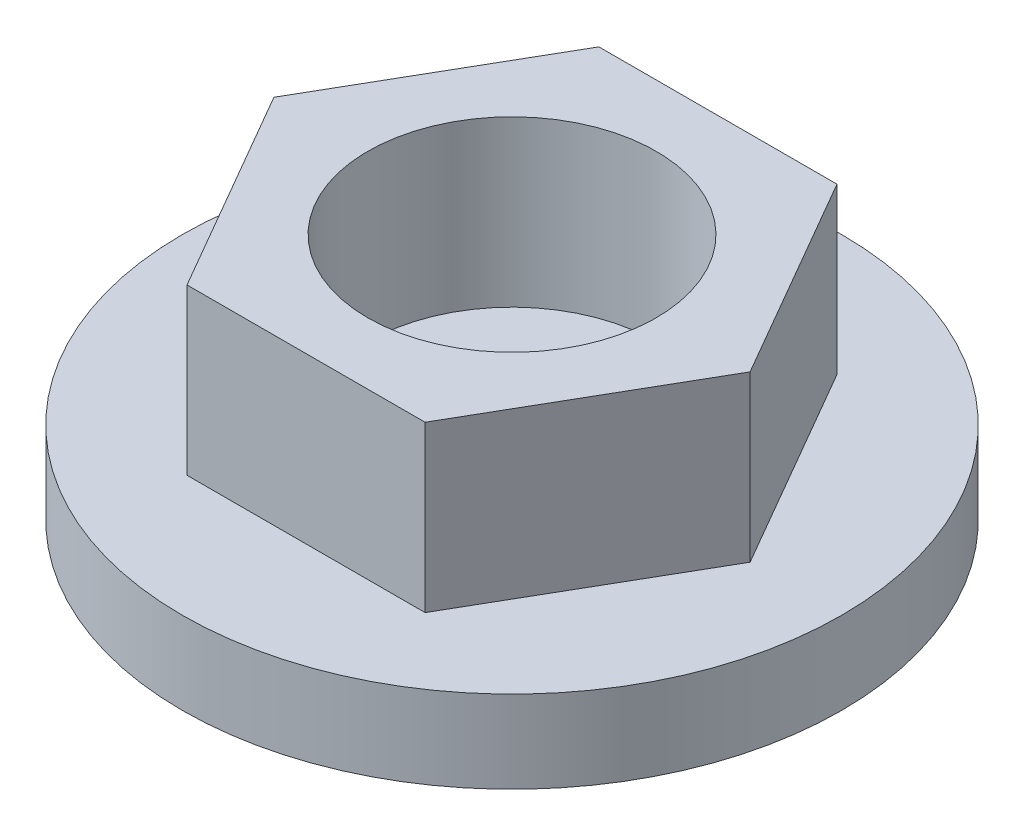
ISO-10303-21;
HEADER;
FILE_DESCRIPTION(('STEP AP214'),'2;1');
FILE_NAME('part.step','',(''),(''),'','','');
FILE_SCHEMA(('AUTOMOTIVE_DESIGN { 1 0 10303 214 1 1 1 1 }'));
ENDSEC;
DATA;
#1=APPLICATION_CONTEXT('core data for automotive mechanical design processes');
#2=APPLICATION_PROTOCOL_DEFINITION('international standard','automotive_design',2000,#1);
#3=PRODUCT_CONTEXT('',#1,'mechanical');
#4=PRODUCT('Part','Part','',(#3));
#5=PRODUCT_RELATED_PRODUCT_CATEGORY('part','',(#4));
#6=PRODUCT_DEFINITION_FORMATION('','',#4);
#7=PRODUCT_DEFINITION_CONTEXT('part definition',#1,'design');
#8=PRODUCT_DEFINITION('design','',#6,#7);
#9=PRODUCT_DEFINITION_SHAPE('','',#8);
#10=(LENGTH_UNIT() NAMED_UNIT(*) SI_UNIT(.MILLI.,.METRE.));
#11=(NAMED_UNIT(*) PLANE_ANGLE_UNIT() SI_UNIT($,.RADIAN.));
#12=(NAMED_UNIT(*) SI_UNIT($,.STERADIAN.) SOLID_ANGLE_UNIT());
#13=UNCERTAINTY_MEASURE_WITH_UNIT(LENGTH_MEASURE(1.E-05),#10,'distance_accuracy_value','');
#14=(GEOMETRIC_REPRESENTATION_CONTEXT(3) GLOBAL_UNCERTAINTY_ASSIGNED_CONTEXT((#13)) GLOBAL_UNIT_ASSIGNED_CONTEXT((#10,
#11,#12)) REPRESENTATION_CONTEXT('',''));
#15=CARTESIAN_POINT('',(0.,0.,0.));
#16=DIRECTION('',(0.,0.,1.));
#17=DIRECTION('',(1.,0.,0.));
#18=AXIS2_PLACEMENT_3D('',#15,#16,#17);
#19=CARTESIAN_POINT('',(0.,1.,0.));
#20=DIRECTION('',(0.,-1.,0.));
#21=DIRECTION('',(0.,0.,-1.));
#22=AXIS2_PLACEMENT_3D('',#19,#20,#21);
#23=CYLINDRICAL_SURFACE('',#22,4.);
#24=CARTESIAN_POINT('',(0.,1.,0.));
#25=DIRECTION('',(0.,1.,0.));
#26=DIRECTION('',(0.,0.,1.));
#27=AXIS2_PLACEMENT_3D('',#24,#25,#26);
#28=CIRCLE('',#27,4.);
#29=CARTESIAN_POINT('',(0.,1.,4.));
#30=VERTEX_POINT('',#29);
#31=EDGE_CURVE('E41',#30,#30,#28,.T.);
#32=ORIENTED_EDGE('',*,*,#31,.F.);
#33=EDGE_LOOP('',(#32));
#34=FACE_BOUND('',#33,.T.);
#35=CARTESIAN_POINT('',(0.,0.,0.));
#36=DIRECTION('',(0.,1.,0.));
#37=DIRECTION('',(0.,0.,1.));
#38=AXIS2_PLACEMENT_3D('',#35,#36,#37);
#39=CIRCLE('',#38,4.);
#40=CARTESIAN_POINT('',(0.,0.,4.));
#41=VERTEX_POINT('',#40);
#42=EDGE_CURVE('E139',#41,#41,#39,.T.);
#43=ORIENTED_EDGE('',*,*,#42,.T.);
#44=EDGE_LOOP('',(#43));
#45=FACE_BOUND('',#44,.T.);
#46=ADVANCED_FACE('F34',(#34,#45),#23,.T.);
#47=CARTESIAN_POINT('',(0.,1.,0.));
#48=DIRECTION('',(0.,1.,0.));
#49=DIRECTION('',(0.,0.,1.));
#50=AXIS2_PLACEMENT_3D('',#47,#48,#49);
#51=PLANE('',#50);
#52=DIRECTION('',(-0.999999831530858,0.,0.000580463828294125));
#53=VECTOR('',#52,1.);
#54=CARTESIAN_POINT('',(1.44192427023907,1.,-2.50083740619595));
#55=LINE('',#54,#53);
#56=CARTESIAN_POINT('',(1.44192427023907,1.,-2.50083740619595));
#57=VERTEX_POINT('',#56);
#58=CARTESIAN_POINT('',(-1.44482658938054,1.,-2.49916175145834));
#59=VERTEX_POINT('',#58);
#60=EDGE_CURVE('E121',#57,#59,#55,.T.);
#61=ORIENTED_EDGE('',*,*,#60,.F.);
#62=DIRECTION('',(-0.50050261218671,0.,-0.865735025971735));
#63=VECTOR('',#62,1.);
#64=CARTESIAN_POINT('',(2.8867508596196,1.,-0.00167565473760398));
#65=LINE('',#64,#63);
#66=CARTESIAN_POINT('',(2.8867508596196,1.,-0.00167565473760398));
#67=VERTEX_POINT('',#66);
#68=EDGE_CURVE('E118',#67,#57,#65,.T.);
#69=ORIENTED_EDGE('',*,*,#68,.F.);
#70=DIRECTION('',(0.499497219344148,0.,-0.866315489800029));
#71=VECTOR('',#70,1.);
#72=CARTESIAN_POINT('',(1.44482658938054,1.,2.49916175145834));
#73=LINE('',#72,#71);
#74=CARTESIAN_POINT('',(1.44482658938054,1.,2.49916175145834));
#75=VERTEX_POINT('',#74);
#76=EDGE_CURVE('E76',#75,#67,#73,.T.);
#77=ORIENTED_EDGE('',*,*,#76,.F.);
#78=DIRECTION('',(0.999999831530858,0.,-0.000580463828294125));
#79=VECTOR('',#78,1.);
#80=CARTESIAN_POINT('',(-1.44192427023907,1.,2.50083740619595));
#81=LINE('',#80,#79);
#82=CARTESIAN_POINT('',(-1.44192427023907,1.,2.50083740619595));
#83=VERTEX_POINT('',#82);
#84=EDGE_CURVE('E127',#83,#75,#81,.T.);
#85=ORIENTED_EDGE('',*,*,#84,.F.);
#86=DIRECTION('',(0.50050261218671,0.,0.865735025971734));
#87=VECTOR('',#86,1.);
#88=CARTESIAN_POINT('',(-2.8867508596196,1.,0.00167565473760394));
#89=LINE('',#88,#87);
#90=CARTESIAN_POINT('',(-2.8867508596196,1.,0.00167565473760394));
#91=VERTEX_POINT('',#90);
#92=EDGE_CURVE('E107',#91,#83,#89,.T.);
#93=ORIENTED_EDGE('',*,*,#92,.F.);
#94=DIRECTION('',(-0.499497219344148,0.,0.866315489800029));
#95=VECTOR('',#94,1.);
#96=CARTESIAN_POINT('',(-1.44482658938054,1.,-2.49916175145834));
#97=LINE('',#96,#95);
#98=EDGE_CURVE('E124',#59,#91,#97,.T.);
#99=ORIENTED_EDGE('',*,*,#98,.F.);
#100=EDGE_LOOP('',(#61,#69,#77,#85,#93,#99));
#101=FACE_BOUND('',#100,.T.);
#102=ORIENTED_EDGE('',*,*,#31,.T.);
#103=EDGE_LOOP('',(#102));
#104=FACE_BOUND('',#103,.T.);
#105=ADVANCED_FACE('F147',(#101,#104),#51,.T.);
#106=CARTESIAN_POINT('',(0.,0.,0.));
#107=DIRECTION('',(0.,1.,0.));
#108=DIRECTION('',(0.,0.,1.));
#109=AXIS2_PLACEMENT_3D('',#106,#107,#108);
#110=PLANE('',#109);
#111=ORIENTED_EDGE('',*,*,#42,.F.);
#112=EDGE_LOOP('',(#111));
#113=FACE_BOUND('',#112,.T.);
#114=ADVANCED_FACE('F145',(#113),#110,.F.);
#115=CARTESIAN_POINT('',(0.,3.,0.));
#116=DIRECTION('',(0.,1.,0.));
#117=DIRECTION('',(0.,0.,1.));
#118=AXIS2_PLACEMENT_3D('',#115,#116,#117);
#119=PLANE('',#118);
#120=DIRECTION('',(-0.50050261218671,0.,-0.865735025971735));
#121=VECTOR('',#120,1.);
#122=CARTESIAN_POINT('',(2.8867508596196,3.,-0.00167565473760398));
#123=LINE('',#122,#121);
#124=CARTESIAN_POINT('',(2.8867508596196,3.,-0.00167565473760398));
#125=VERTEX_POINT('',#124);
#126=CARTESIAN_POINT('',(1.44192427023907,3.,-2.50083740619595));
#127=VERTEX_POINT('',#126);
#128=EDGE_CURVE('E130',#125,#127,#123,.T.);
#129=ORIENTED_EDGE('',*,*,#128,.T.);
#130=DIRECTION('',(-0.999999831530858,0.,0.000580463828294125));
#131=VECTOR('',#130,1.);
#132=CARTESIAN_POINT('',(1.44192427023907,3.,-2.50083740619595));
#133=LINE('',#132,#131);
#134=CARTESIAN_POINT('',(-1.44482658938054,3.,-2.49916175145834));
#135=VERTEX_POINT('',#134);
#136=EDGE_CURVE('E84',#127,#135,#133,.T.);
#137=ORIENTED_EDGE('',*,*,#136,.T.);
#138=DIRECTION('',(-0.499497219344148,0.,0.866315489800029));
#139=VECTOR('',#138,1.);
#140=CARTESIAN_POINT('',(-1.44482658938054,3.,-2.49916175145834));
#141=LINE('',#140,#139);
#142=CARTESIAN_POINT('',(-2.8867508596196,3.,0.00167565473760394));
#143=VERTEX_POINT('',#142);
#144=EDGE_CURVE('E98',#135,#143,#141,.T.);
#145=ORIENTED_EDGE('',*,*,#144,.T.);
#146=DIRECTION('',(0.50050261218671,0.,0.865735025971734));
#147=VECTOR('',#146,1.);
#148=CARTESIAN_POINT('',(-2.8867508596196,3.,0.00167565473760394));
#149=LINE('',#148,#147);
#150=CARTESIAN_POINT('',(-1.44192427023907,3.,2.50083740619595));
#151=VERTEX_POINT('',#150);
#152=EDGE_CURVE('E91',#143,#151,#149,.T.);
#153=ORIENTED_EDGE('',*,*,#152,.T.);
#154=DIRECTION('',(0.999999831530858,0.,-0.000580463828294125));
#155=VECTOR('',#154,1.);
#156=CARTESIAN_POINT('',(-1.44192427023907,3.,2.50083740619595));
#157=LINE('',#156,#155);
#158=CARTESIAN_POINT('',(1.44482658938054,3.,2.49916175145834));
#159=VERTEX_POINT('',#158);
#160=EDGE_CURVE('E96',#151,#159,#157,.T.);
#161=ORIENTED_EDGE('',*,*,#160,.T.);
#162=DIRECTION('',(0.499497219344148,0.,-0.866315489800029));
#163=VECTOR('',#162,1.);
#164=CARTESIAN_POINT('',(1.44482658938054,3.,2.49916175145834));
#165=LINE('',#164,#163);
#166=EDGE_CURVE('E56',#159,#125,#165,.T.);
#167=ORIENTED_EDGE('',*,*,#166,.T.);
#168=EDGE_LOOP('',(#129,#137,#145,#153,#161,#167));
#169=FACE_BOUND('',#168,.T.);
#170=CARTESIAN_POINT('',(0.,3.,0.));
#171=DIRECTION('',(0.,1.,0.));
#172=DIRECTION('',(0.,0.,1.));
#173=AXIS2_PLACEMENT_3D('',#170,#171,#172);
#174=CIRCLE('',#173,1.75);
#175=CARTESIAN_POINT('',(0.,3.,1.75));
#176=VERTEX_POINT('',#175);
#177=EDGE_CURVE('E122',#176,#176,#174,.T.);
#178=ORIENTED_EDGE('',*,*,#177,.F.);
#179=EDGE_LOOP('',(#178));
#180=FACE_BOUND('',#179,.T.);
#181=ADVANCED_FACE('F93',(#169,#180),#119,.T.);
#182=CARTESIAN_POINT('',(2.8867508596196,3.,-0.00167565473760398));
#183=DIRECTION('',(-0.865735025971735,0.,0.50050261218671));
#184=DIRECTION('',(0.50050261218671,0.,0.865735025971735));
#185=AXIS2_PLACEMENT_3D('',#182,#183,#184);
#186=PLANE('',#185);
#187=ORIENTED_EDGE('',*,*,#68,.T.);
#188=DIRECTION('',(0.,-1.,0.));
#189=VECTOR('',#188,1.);
#190=CARTESIAN_POINT('',(1.44192427023907,3.,-2.50083740619595));
#191=LINE('',#190,#189);
#192=EDGE_CURVE('E137',#127,#57,#191,.T.);
#193=ORIENTED_EDGE('',*,*,#192,.F.);
#194=ORIENTED_EDGE('',*,*,#128,.F.);
#195=DIRECTION('',(0.,-1.,0.));
#196=VECTOR('',#195,1.);
#197=CARTESIAN_POINT('',(2.8867508596196,3.,-0.00167565473760398));
#198=LINE('',#197,#196);
#199=EDGE_CURVE('E114',#125,#67,#198,.T.);
#200=ORIENTED_EDGE('',*,*,#199,.T.);
#201=EDGE_LOOP('',(#187,#193,#194,#200));
#202=FACE_BOUND('',#201,.T.);
#203=ADVANCED_FACE('F152',(#202),#186,.F.);
#204=CARTESIAN_POINT('',(1.44192427023907,3.,-2.50083740619595));
#205=DIRECTION('',(0.000580463828294125,0.,0.999999831530858));
#206=DIRECTION('',(0.999999831530858,0.,-0.000580463828294125));
#207=AXIS2_PLACEMENT_3D('',#204,#205,#206);
#208=PLANE('',#207);
#209=ORIENTED_EDGE('',*,*,#60,.T.);
#210=DIRECTION('',(0.,-1.,0.));
#211=VECTOR('',#210,1.);
#212=CARTESIAN_POINT('',(-1.44482658938054,3.,-2.49916175145834));
#213=LINE('',#212,#211);
#214=EDGE_CURVE('E134',#135,#59,#213,.T.);
#215=ORIENTED_EDGE('',*,*,#214,.F.);
#216=ORIENTED_EDGE('',*,*,#136,.F.);
#217=ORIENTED_EDGE('',*,*,#192,.T.);
#218=EDGE_LOOP('',(#209,#215,#216,#217));
#219=FACE_BOUND('',#218,.T.);
#220=ADVANCED_FACE('F185',(#219),#208,.F.);
#221=CARTESIAN_POINT('',(-1.44482658938054,3.,-2.49916175145834));
#222=DIRECTION('',(0.866315489800029,0.,0.499497219344148));
#223=DIRECTION('',(0.499497219344148,0.,-0.866315489800029));
#224=AXIS2_PLACEMENT_3D('',#221,#222,#223);
#225=PLANE('',#224);
#226=ORIENTED_EDGE('',*,*,#98,.T.);
#227=DIRECTION('',(0.,-1.,0.));
#228=VECTOR('',#227,1.);
#229=CARTESIAN_POINT('',(-2.8867508596196,3.,0.00167565473760394));
#230=LINE('',#229,#228);
#231=EDGE_CURVE('E110',#143,#91,#230,.T.);
#232=ORIENTED_EDGE('',*,*,#231,.F.);
#233=ORIENTED_EDGE('',*,*,#144,.F.);
#234=ORIENTED_EDGE('',*,*,#214,.T.);
#235=EDGE_LOOP('',(#226,#232,#233,#234));
#236=FACE_BOUND('',#235,.T.);
#237=ADVANCED_FACE('F195',(#236),#225,.F.);
#238=CARTESIAN_POINT('',(-2.8867508596196,3.,0.00167565473760394));
#239=DIRECTION('',(0.865735025971735,0.,-0.50050261218671));
#240=DIRECTION('',(-0.50050261218671,0.,-0.865735025971735));
#241=AXIS2_PLACEMENT_3D('',#238,#239,#240);
#242=PLANE('',#241);
#243=ORIENTED_EDGE('',*,*,#92,.T.);
#244=DIRECTION('',(0.,-1.,0.));
#245=VECTOR('',#244,1.);
#246=CARTESIAN_POINT('',(-1.44192427023907,3.,2.50083740619595));
#247=LINE('',#246,#245);
#248=EDGE_CURVE('E104',#151,#83,#247,.T.);
#249=ORIENTED_EDGE('',*,*,#248,.F.);
#250=ORIENTED_EDGE('',*,*,#152,.F.);
#251=ORIENTED_EDGE('',*,*,#231,.T.);
#252=EDGE_LOOP('',(#243,#249,#250,#251));
#253=FACE_BOUND('',#252,.T.);
#254=ADVANCED_FACE('F105',(#253),#242,.F.);
#255=CARTESIAN_POINT('',(-1.44192427023907,3.,2.50083740619595));
#256=DIRECTION('',(-0.000580463828294125,0.,-0.999999831530858));
#257=DIRECTION('',(-0.999999831530858,0.,0.000580463828294125));
#258=AXIS2_PLACEMENT_3D('',#255,#256,#257);
#259=PLANE('',#258);
#260=ORIENTED_EDGE('',*,*,#84,.T.);
#261=DIRECTION('',(0.,-1.,0.));
#262=VECTOR('',#261,1.);
#263=CARTESIAN_POINT('',(1.44482658938054,3.,2.49916175145834));
#264=LINE('',#263,#262);
#265=EDGE_CURVE('E48',#159,#75,#264,.T.);
#266=ORIENTED_EDGE('',*,*,#265,.F.);
#267=ORIENTED_EDGE('',*,*,#160,.F.);
#268=ORIENTED_EDGE('',*,*,#248,.T.);
#269=EDGE_LOOP('',(#260,#266,#267,#268));
#270=FACE_BOUND('',#269,.T.);
#271=ADVANCED_FACE('F112',(#270),#259,.F.);
#272=CARTESIAN_POINT('',(1.44482658938054,3.,2.49916175145834));
#273=DIRECTION('',(-0.866315489800029,0.,-0.499497219344148));
#274=DIRECTION('',(-0.499497219344148,0.,0.866315489800029));
#275=AXIS2_PLACEMENT_3D('',#272,#273,#274);
#276=PLANE('',#275);
#277=ORIENTED_EDGE('',*,*,#76,.T.);
#278=ORIENTED_EDGE('',*,*,#199,.F.);
#279=ORIENTED_EDGE('',*,*,#166,.F.);
#280=ORIENTED_EDGE('',*,*,#265,.T.);
#281=EDGE_LOOP('',(#277,#278,#279,#280));
#282=FACE_BOUND('',#281,.T.);
#283=ADVANCED_FACE('F221',(#282),#276,.F.);
#284=CARTESIAN_POINT('',(0.,3.,0.));
#285=DIRECTION('',(0.,-1.,0.));
#286=DIRECTION('',(0.,0.,-1.));
#287=AXIS2_PLACEMENT_3D('',#284,#285,#286);
#288=CYLINDRICAL_SURFACE('',#287,1.75);
#289=ORIENTED_EDGE('',*,*,#177,.T.);
#290=EDGE_LOOP('',(#289));
#291=FACE_BOUND('',#290,.T.);
#292=CARTESIAN_POINT('',(0.,1.,0.));
#293=DIRECTION('',(0.,1.,0.));
#294=DIRECTION('',(0.,0.,1.));
#295=AXIS2_PLACEMENT_3D('',#292,#293,#294);
#296=CIRCLE('',#295,1.75);
#297=CARTESIAN_POINT('',(0.,1.,1.75));
#298=VERTEX_POINT('',#297);
#299=EDGE_CURVE('E11',#298,#298,#296,.F.);
#300=ORIENTED_EDGE('',*,*,#299,.T.);
#301=EDGE_LOOP('',(#300));
#302=FACE_BOUND('',#301,.T.);
#303=ADVANCED_FACE('F230',(#291,#302),#288,.F.);
#304=ORIENTED_EDGE('',*,*,#299,.F.);
#305=EDGE_LOOP('',(#304));
#306=FACE_BOUND('',#305,.T.);
#307=ADVANCED_FACE('F156',(#306),#51,.T.);
#308=CLOSED_SHELL('',(#46,#105,#114,#181,#203,#220,#237,#254,#271,#283,#303,#307));
#309=MANIFOLD_SOLID_BREP('B2',#308);
#310=ADVANCED_BREP_SHAPE_REPRESENTATION('',(#18,#309),#14);
#311=SHAPE_DEFINITION_REPRESENTATION(#9,#310);
ENDSEC;
END-ISO-10303-21;
